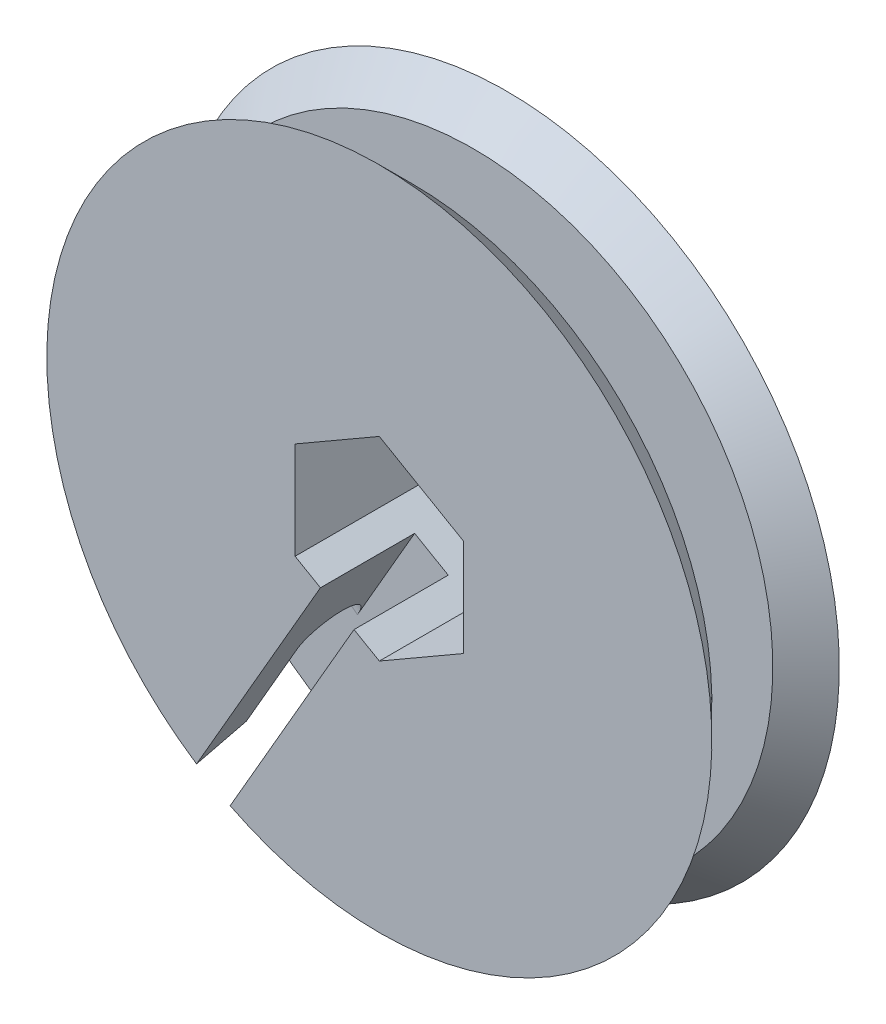
ISO-10303-21;
HEADER;
FILE_DESCRIPTION(('STEP AP214'),'2;1');
FILE_NAME('part.step','',(''),(''),'','','');
FILE_SCHEMA(('AUTOMOTIVE_DESIGN { 1 0 10303 214 1 1 1 1 }'));
ENDSEC;
DATA;
#1=APPLICATION_CONTEXT('core data for automotive mechanical design processes');
#2=APPLICATION_PROTOCOL_DEFINITION('international standard','automotive_design',2000,#1);
#3=PRODUCT_CONTEXT('',#1,'mechanical');
#4=PRODUCT('Part','Part','',(#3));
#5=PRODUCT_RELATED_PRODUCT_CATEGORY('part','',(#4));
#6=PRODUCT_DEFINITION_FORMATION('','',#4);
#7=PRODUCT_DEFINITION_CONTEXT('part definition',#1,'design');
#8=PRODUCT_DEFINITION('design','',#6,#7);
#9=PRODUCT_DEFINITION_SHAPE('','',#8);
#10=(LENGTH_UNIT() NAMED_UNIT(*) SI_UNIT(.MILLI.,.METRE.));
#11=(NAMED_UNIT(*) PLANE_ANGLE_UNIT() SI_UNIT($,.RADIAN.));
#12=(NAMED_UNIT(*) SI_UNIT($,.STERADIAN.) SOLID_ANGLE_UNIT());
#13=UNCERTAINTY_MEASURE_WITH_UNIT(LENGTH_MEASURE(1.E-05),#10,'distance_accuracy_value','');
#14=(GEOMETRIC_REPRESENTATION_CONTEXT(3) GLOBAL_UNCERTAINTY_ASSIGNED_CONTEXT((#13)) GLOBAL_UNIT_ASSIGNED_CONTEXT((#10,
#11,#12)) REPRESENTATION_CONTEXT('',''));
#15=CARTESIAN_POINT('',(0.,0.,0.));
#16=DIRECTION('',(0.,0.,1.));
#17=DIRECTION('',(1.,0.,0.));
#18=AXIS2_PLACEMENT_3D('',#15,#16,#17);
#19=CARTESIAN_POINT('',(0.,0.,5.75));
#20=DIRECTION('',(0.,0.,-1.));
#21=DIRECTION('',(-1.,0.,0.));
#22=AXIS2_PLACEMENT_3D('',#19,#20,#21);
#23=TOROIDAL_SURFACE('',#22,18.,2.75);
#24=CARTESIAN_POINT('',(0.,0.,3.));
#25=DIRECTION('',(0.,0.,-1.));
#26=DIRECTION('',(-1.,0.,0.));
#27=AXIS2_PLACEMENT_3D('',#24,#25,#26);
#28=CIRCLE('',#27,18.);
#29=CARTESIAN_POINT('',(-10.4729087452961,-14.6396100498852,3.));
#30=VERTEX_POINT('',#29);
#31=CARTESIAN_POINT('',(-7.44181983205055,-16.3896100498852,3.));
#32=VERTEX_POINT('',#31);
#33=EDGE_CURVE('E187',#30,#32,#28,.T.);
#34=ORIENTED_EDGE('',*,*,#33,.F.);
#35=CARTESIAN_POINT('',(-11.6302072230688,-16.6441098129096,4.2499890800237));
#36=CARTESIAN_POINT('',(-11.5878732108356,-16.5707851528336,4.12038726326359));
#37=CARTESIAN_POINT('',(-11.5400194636918,-16.4879000314479,3.99785967698924));
#38=CARTESIAN_POINT('',(-11.4346544351728,-16.3054024487122,3.77053264273934));
#39=CARTESIAN_POINT('',(-11.3771312197183,-16.2057693169302,3.66575542714724));
#40=CARTESIAN_POINT('',(-11.2541439715946,-15.9927491544968,3.47704626531254));
#41=CARTESIAN_POINT('',(-11.1886850749709,-15.8793710197372,3.39310094255813));
#42=CARTESIAN_POINT('',(-11.0516846548416,-15.6420793314149,3.24833269201992));
#43=CARTESIAN_POINT('',(-10.9801446350101,-15.5181683822924,3.18750406842389));
#44=CARTESIAN_POINT('',(-10.8327692864991,-15.2629067908881,3.09045597404014));
#45=CARTESIAN_POINT('',(-10.756921756323,-15.1315350149945,3.05431061615199));
#46=CARTESIAN_POINT('',(-10.6032691672833,-14.8654009240632,3.00790259502964));
#47=CARTESIAN_POINT('',(-10.5254639893024,-14.7306384027084,2.99764151064401));
#48=CARTESIAN_POINT('',(-10.3698236442787,-14.4610614174198,3.00327820116145));
#49=CARTESIAN_POINT('',(-10.2919892870546,-14.3262483561332,3.01926568155113));
#50=CARTESIAN_POINT('',(-10.138761481491,-14.0608500117647,3.07711058119008));
#51=CARTESIAN_POINT('',(-10.0633680610195,-13.9302647769516,3.11896829568908));
#52=CARTESIAN_POINT('',(-9.91706211154782,-13.6768554390171,3.227456962004));
#53=CARTESIAN_POINT('',(-9.84615565399839,-13.5540418519568,3.29412067492037));
#54=CARTESIAN_POINT('',(-9.7109597319452,-13.3198756459845,3.45035594958466));
#55=CARTESIAN_POINT('',(-9.64667022188305,-13.2085229481632,3.5399273535959));
#56=CARTESIAN_POINT('',(-9.5266850924901,-13.0007026079019,3.73926775614399));
#57=CARTESIAN_POINT('',(-9.47097223958232,-12.904205116031,3.8489952538858));
#58=CARTESIAN_POINT('',(-9.369605803163,-12.7286332979705,4.08568511296534));
#59=CARTESIAN_POINT('',(-9.32395196119028,-12.649558524113,4.21264703133785));
#60=CARTESIAN_POINT('',(-9.24425758650131,-12.5115238180743,4.47950803741538));
#61=CARTESIAN_POINT('',(-9.2101583382367,-12.4524621875801,4.61933698066279));
#62=CARTESIAN_POINT('',(-9.1542609013387,-12.3556449868599,4.90850620417376));
#63=CARTESIAN_POINT('',(-9.13246226007002,-12.3178886326466,5.05784613422883));
#64=CARTESIAN_POINT('',(-9.10190881403054,-12.2649685117599,5.36085839077977));
#65=CARTESIAN_POINT('',(-9.09307831668697,-12.2496736417047,5.51450019913872));
#66=CARTESIAN_POINT('',(-9.0884830588504,-12.2417144216579,5.8225617680831));
#67=CARTESIAN_POINT('',(-9.09271800466835,-12.2490495629819,5.97698151110398));
#68=CARTESIAN_POINT('',(-9.11409403291119,-12.2860739299625,6.28172881303999));
#69=CARTESIAN_POINT('',(-9.13119631661494,-12.3156959542629,6.43206726905796));
#70=CARTESIAN_POINT('',(-9.17775529923944,-12.3963384777172,6.72488423472456));
#71=CARTESIAN_POINT('',(-9.20721206183191,-12.4473590871539,6.86736270386061));
#72=CARTESIAN_POINT('',(-9.27768328688092,-12.5694188294104,7.14071851310316));
#73=CARTESIAN_POINT('',(-9.31871908453953,-12.6404949158842,7.27157384598979));
#74=CARTESIAN_POINT('',(-9.41113662763013,-12.8005667960278,7.51774629299881));
#75=CARTESIAN_POINT('',(-9.46251865496873,-12.8895630779742,7.63306298359256));
#76=CARTESIAN_POINT('',(-9.57446578789301,-13.0834611999607,7.84555963013542));
#77=CARTESIAN_POINT('',(-9.63507929102786,-13.188446867015,7.94263759464087));
#78=CARTESIAN_POINT('',(-9.76355670512832,-13.410976275862,8.1152004491073));
#79=CARTESIAN_POINT('',(-9.83142084447257,-13.5285204132182,8.19068465863831));
#80=CARTESIAN_POINT('',(-9.97288685280419,-13.7735467271925,8.31834789330166));
#81=CARTESIAN_POINT('',(-10.0465189324637,-13.9010812302298,8.37039303424943));
#82=CARTESIAN_POINT('',(-10.1970999724105,-14.1618952420742,8.44910547318261));
#83=CARTESIAN_POINT('',(-10.2740490002385,-14.2951748678653,8.47577225415122));
#84=CARTESIAN_POINT('',(-10.4293269764353,-14.5641242119346,8.50301786462417));
#85=CARTESIAN_POINT('',(-10.5076593704363,-14.6997998982228,8.50351823566752));
#86=CARTESIAN_POINT('',(-10.6632540383335,-14.9692977684076,8.47819859893682));
#87=CARTESIAN_POINT('',(-10.7405163115465,-15.1031199511209,8.45237857436141));
#88=CARTESIAN_POINT('',(-10.891734265545,-15.3650371304628,8.3751351096366));
#89=CARTESIAN_POINT('',(-10.9656914923691,-15.4931348049092,8.32372378018213));
#90=CARTESIAN_POINT('',(-11.1082211642045,-15.7400034381142,8.19672391504663));
#91=CARTESIAN_POINT('',(-11.1767936716681,-15.8587745050435,8.12113565982292));
#92=CARTESIAN_POINT('',(-11.3063816981475,-16.0832275509584,7.94816196087622));
#93=CARTESIAN_POINT('',(-11.3674194593242,-16.1889480544966,7.85084317571571));
#94=CARTESIAN_POINT('',(-11.4804185505915,-16.3846682217808,7.63701751113077));
#95=CARTESIAN_POINT('',(-11.5323800506601,-16.474668179937,7.52051099112858));
#96=CARTESIAN_POINT('',(-11.6255340389371,-16.6360156205605,7.27211090960717));
#97=CARTESIAN_POINT('',(-11.6667681887244,-16.707435262999,7.14027984191858));
#98=CARTESIAN_POINT('',(-11.737538955159,-16.8300138261543,6.86461190499521));
#99=CARTESIAN_POINT('',(-11.7670762653426,-16.8811739481113,6.72077574818616));
#100=CARTESIAN_POINT('',(-11.8135148192723,-16.9616078829475,6.42572285174617));
#101=CARTESIAN_POINT('',(-11.8304602332982,-16.9909582009957,6.27453391265812));
#102=CARTESIAN_POINT('',(-11.851395923593,-17.0272198802777,5.96856786256901));
#103=CARTESIAN_POINT('',(-11.8553831217245,-17.0341259100214,5.81378990781392));
#104=CARTESIAN_POINT('',(-11.8502860409475,-17.0252975071453,5.50533036907906));
#105=CARTESIAN_POINT('',(-11.8412200445128,-17.0095947406991,5.3516475540415));
#106=CARTESIAN_POINT('',(-11.8103136442289,-16.9560632851284,5.04964310594008));
#107=CARTESIAN_POINT('',(-11.7884887742966,-16.918261501537,4.90131518605536));
#108=CARTESIAN_POINT('',(-11.7433769108242,-16.8401254619788,4.66890948976915));
#109=CARTESIAN_POINT('',(-11.7238093301179,-16.8062334180142,4.58186827503471));
#110=CARTESIAN_POINT('',(-11.6802615416742,-16.7308064358725,4.41231986651793));
#111=CARTESIAN_POINT('',(-11.6562813386246,-16.6892715058149,4.32981266791909));
#112=CARTESIAN_POINT('',(-11.6302072230688,-16.6441098129096,4.2499890800237));
#113=B_SPLINE_CURVE_WITH_KNOTS('',3,(#35,#36,#37,#38,#39,#40,#41,#42,#43,#44,#45,#46,#47,#48,
#49,#50,#51,#52,#53,#54,#55,#56,#57,#58,#59,#60,#61,#62,#63,#64,#65,#66,#67,#68,#69,#70,#71,#72,
#73,#74,#75,#76,#77,#78,#79,#80,#81,#82,#83,#84,#85,#86,#87,#88,#89,#90,#91,#92,#93,#94,#95,#96,
#97,#98,#99,#100,#101,#102,#103,#104,#105,#106,#107,#108,#109,#110,#111,#112),.UNSPECIFIED.,.T.,
.F.,(4,2,2,2,2,2,2,2,2,2,2,2,2,2,2,2,2,2,2,2,2,2,2,2,2,2,2,2,2,2,2,2,2,2,2,2,2,2,4),(0.,
0.464072250797451,0.928721523454805,1.39307166040032,1.85730731003851,2.32293079596454,
2.78858268257939,3.2558292675635,3.72308118520024,4.19095240198698,4.65882039721521,
5.12573564954755,5.59263890332939,6.05713266672856,6.52160933666363,6.98336401904191,
7.44510832203196,7.90546588540078,8.36582582136016,8.82703960558291,9.28826595832662,
9.75199935995543,10.2157473724454,10.6821117266015,11.1484855814915,11.6162577513761,
12.0840302198584,12.5515815323029,13.0191274212529,13.4852583454795,13.9513805391933,
14.4156644880718,14.8799209042123,15.3425409970934,15.8052709742448,16.267353475904,
16.728874560743,17.014703512683,17.3005321609797),.UNSPECIFIED.);
#114=CARTESIAN_POINT('',(-10.4729087452961,-14.6396100498852,8.5));
#115=VERTEX_POINT('',#114);
#116=EDGE_CURVE('E169',#30,#115,#113,.T.);
#117=ORIENTED_EDGE('',*,*,#116,.T.);
#118=CARTESIAN_POINT('',(0.,0.,8.5));
#119=DIRECTION('',(0.,0.,-1.));
#120=DIRECTION('',(-1.,0.,0.));
#121=AXIS2_PLACEMENT_3D('',#118,#119,#120);
#122=CIRCLE('',#121,18.);
#123=CARTESIAN_POINT('',(-7.44181983205055,-16.3896100498852,8.5));
#124=VERTEX_POINT('',#123);
#125=EDGE_CURVE('E11',#115,#124,#122,.T.);
#126=ORIENTED_EDGE('',*,*,#125,.T.);
#127=CARTESIAN_POINT('',(-8.37169437330341,-18.0002,7.78309526483977));
#128=CARTESIAN_POINT('',(-8.34290417700881,-17.9503339172579,7.83534598348775));
#129=CARTESIAN_POINT('',(-8.31300493667212,-17.898546913887,7.88514571672198));
#130=CARTESIAN_POINT('',(-8.25121458982801,-17.7915228937357,7.97952028212905));
#131=CARTESIAN_POINT('',(-8.21932361925915,-17.7362861124078,8.02409547028883));
#132=CARTESIAN_POINT('',(-8.15379967419848,-17.6227953104503,8.10766998921819));
#133=CARTESIAN_POINT('',(-8.1201681907222,-17.5645438723355,8.1466739882771));
#134=CARTESIAN_POINT('',(-8.05139346199464,-17.4454225479026,8.21887560465343));
#135=CARTESIAN_POINT('',(-8.01625022690089,-17.3845526791779,8.25207326097632));
#136=CARTESIAN_POINT('',(-7.90889078128192,-17.1986006646934,8.34261166395664));
#137=CARTESIAN_POINT('',(-7.83471043544557,-17.0701165367818,8.39094161222455));
#138=CARTESIAN_POINT('',(-7.68340314178073,-16.8080446165986,8.46204593247323));
#139=CARTESIAN_POINT('',(-7.6062766129129,-16.6744575499881,8.48482392417254));
#140=CARTESIAN_POINT('',(-7.45098531383821,-16.4054851300173,8.50430626389989));
#141=CARTESIAN_POINT('',(-7.37281830670653,-16.2700959021897,8.50094021856554));
#142=CARTESIAN_POINT('',(-7.2178620980298,-16.0017038758133,8.46806315037303));
#143=CARTESIAN_POINT('',(-7.14107311214338,-15.8687014507963,8.43854807100676));
#144=CARTESIAN_POINT('',(-6.99090664980816,-15.6086055084389,8.35411831371802));
#145=CARTESIAN_POINT('',(-6.9175360732961,-15.4815239421394,8.29915452206395));
#146=CARTESIAN_POINT('',(-6.77646128691792,-15.2371752444654,8.16534749049601));
#147=CARTESIAN_POINT('',(-6.70875674031571,-15.119907529847,8.08650567095801));
#148=CARTESIAN_POINT('',(-6.58102602779159,-14.8986714460682,7.90724659132727));
#149=CARTESIAN_POINT('',(-6.52099107139563,-14.7946878513602,7.80685439151984));
#150=CARTESIAN_POINT('',(-6.41024650035678,-14.6028726276585,7.58725161760995));
#151=CARTESIAN_POINT('',(-6.35953686892767,-14.5150409695902,7.46804107738252));
#152=CARTESIAN_POINT('',(-6.26913990319727,-14.3584688320951,7.21475574364981));
#153=CARTESIAN_POINT('',(-6.2294034004132,-14.289643190358,7.08075115141389));
#154=CARTESIAN_POINT('',(-6.16182231311254,-14.1725893135225,6.80124130200334));
#155=CARTESIAN_POINT('',(-6.13397722812228,-14.1243602115783,6.65573652914191));
#156=CARTESIAN_POINT('',(-6.09114032511835,-14.0501645191366,6.35829473792065));
#157=CARTESIAN_POINT('',(-6.07607225874013,-14.0240658625977,6.20640163692264));
#158=CARTESIAN_POINT('',(-6.05895719690165,-13.9944217059188,5.89970988207622));
#159=CARTESIAN_POINT('',(-6.05690986374064,-13.9908756208639,5.74491130368761));
#160=CARTESIAN_POINT('',(-6.06587886773261,-14.0064103914713,5.43745675481903));
#161=CARTESIAN_POINT('',(-6.07684327429412,-14.0254013007106,5.28479471095207));
#162=CARTESIAN_POINT('',(-6.1114236215487,-14.0852962190989,4.98531661395201));
#163=CARTESIAN_POINT('',(-6.13503951810695,-14.1262001518041,4.83850054042711));
#164=CARTESIAN_POINT('',(-6.19424735114996,-14.2287511268407,4.55475521815561));
#165=CARTESIAN_POINT('',(-6.22984739048379,-14.2904122037183,4.41783273505633));
#166=CARTESIAN_POINT('',(-6.31198288269177,-14.4326750493272,4.15780592702638));
#167=CARTESIAN_POINT('',(-6.35851864088952,-14.5132773468945,4.03470198804919));
#168=CARTESIAN_POINT('',(-6.46143937791122,-14.6915412925685,3.80515811157304));
#169=CARTESIAN_POINT('',(-6.51787104047976,-14.7892837992928,3.69880190855386));
#170=CARTESIAN_POINT('',(-6.63881491753643,-14.9987647392193,3.5064124916221));
#171=CARTESIAN_POINT('',(-6.70332729936625,-15.1105034622658,3.42037969868869));
#172=CARTESIAN_POINT('',(-6.83901321120814,-15.3455183554473,3.27055223248416));
#173=CARTESIAN_POINT('',(-6.91022384515789,-15.4688587914874,3.20689195143484));
#174=CARTESIAN_POINT('',(-7.05696654870152,-15.723024609665,3.10428039759601));
#175=CARTESIAN_POINT('',(-7.13249879956462,-15.85385030577,3.06533016209321));
#176=CARTESIAN_POINT('',(-7.28604516451325,-16.1198004111785,3.01312589761576));
#177=CARTESIAN_POINT('',(-7.36406755187968,-16.254939150225,2.99996916362505));
#178=CARTESIAN_POINT('',(-7.52011463286922,-16.5252206228717,3.00003094241118));
#179=CARTESIAN_POINT('',(-7.5981393264603,-16.6603633564164,3.01325050653574));
#180=CARTESIAN_POINT('',(-7.75200767116121,-16.9268711471149,3.06572514457234));
#181=CARTESIAN_POINT('',(-7.82785008425842,-17.0582340599679,3.1049947042857));
#182=CARTESIAN_POINT('',(-7.97513167120267,-17.3133332515747,3.20851804393509));
#183=CARTESIAN_POINT('',(-8.04657304279469,-17.4370733369345,3.27275923470217));
#184=CARTESIAN_POINT('',(-8.16095837520867,-17.6351945443162,3.3998723655637));
#185=CARTESIAN_POINT('',(-8.20566460294572,-17.7126280021715,3.45650942103528));
#186=CARTESIAN_POINT('',(-8.29148601802384,-17.8612750534642,3.57955761733142));
#187=CARTESIAN_POINT('',(-8.33260593598289,-17.9324968405724,3.64595556233421));
#188=CARTESIAN_POINT('',(-8.37169437330341,-18.0002,3.71690473516024));
#189=B_SPLINE_CURVE_WITH_KNOTS('',3,(#127,#128,#129,#130,#131,#132,#133,#134,#135,#136,#137,
#138,#139,#140,#141,#142,#143,#144,#145,#146,#147,#148,#149,#150,#151,#152,#153,#154,#155,#156,
#157,#158,#159,#160,#161,#162,#163,#164,#165,#166,#167,#168,#169,#170,#171,#172,#173,#174,#175,
#176,#177,#178,#179,#180,#181,#182,#183,#184,#185,#186,#187,#188),.UNSPECIFIED.,.F.,.F.,(4,2,2,
2,2,2,2,2,2,2,2,2,2,2,2,2,2,2,2,2,2,2,2,2,2,2,2,2,2,2,4),(0.,0.233183931268337,
0.466351964740276,0.699323457954253,0.932293386067148,1.39799172016466,1.86362407458475,
2.33051058753583,2.79746954142753,3.26533346479391,3.73316956290787,4.20046454755202,
4.66775869102445,5.13292368822005,5.59806910610274,6.06041877718607,6.52275645689654,
6.98325510937192,7.44375215540506,7.90456118517497,8.3653830821921,8.82844043918471,
9.29150738710739,9.75731026363949,10.2231326925098,10.690708882566,11.1583037103773,
11.6261587750904,12.0937782811581,12.4106490668425,12.7270953462373),.UNSPECIFIED.);
#190=EDGE_CURVE('E222',#124,#32,#189,.T.);
#191=ORIENTED_EDGE('',*,*,#190,.T.);
#192=EDGE_LOOP('',(#34,#117,#126,#191));
#193=FACE_BOUND('',#192,.T.);
#194=ADVANCED_FACE('F41',(#193),#23,.F.);
#195=CARTESIAN_POINT('',(0.,0.,8.5));
#196=DIRECTION('',(0.,0.,-1.));
#197=DIRECTION('',(-1.,0.,0.));
#198=AXIS2_PLACEMENT_3D('',#195,#196,#197);
#199=PLANE('',#198);
#200=DIRECTION('',(0.5,0.866025403784439,0.));
#201=VECTOR('',#200,1.);
#202=CARTESIAN_POINT('',(-1.51554445662277,0.874999999999998,8.5));
#203=LINE('',#202,#201);
#204=CARTESIAN_POINT('',(-14.9871581313093,-22.4585193444967,8.5));
#205=VERTEX_POINT('',#204);
#206=EDGE_CURVE('E215',#205,#115,#203,.T.);
#207=ORIENTED_EDGE('',*,*,#206,.F.);
#208=CARTESIAN_POINT('',(0.,0.,8.5));
#209=DIRECTION('',(0.,0.,-1.));
#210=DIRECTION('',(-1.,0.,0.));
#211=AXIS2_PLACEMENT_3D('',#208,#209,#210);
#212=CIRCLE('',#211,27.);
#213=CARTESIAN_POINT('',(-11.9560692180637,-24.2085193444967,8.5));
#214=VERTEX_POINT('',#213);
#215=EDGE_CURVE('E49',#205,#214,#212,.T.);
#216=ORIENTED_EDGE('',*,*,#215,.T.);
#217=DIRECTION('',(-0.5,-0.866025403784439,0.));
#218=VECTOR('',#217,1.);
#219=CARTESIAN_POINT('',(1.51554445662277,-0.875,8.5));
#220=LINE('',#219,#218);
#221=EDGE_CURVE('E214',#124,#214,#220,.T.);
#222=ORIENTED_EDGE('',*,*,#221,.F.);
#223=ORIENTED_EDGE('',*,*,#125,.F.);
#224=EDGE_LOOP('',(#207,#216,#222,#223));
#225=FACE_BOUND('',#224,.T.);
#226=ADVANCED_FACE('F212',(#225),#199,.T.);
#227=CARTESIAN_POINT('',(0.,0.,8.5));
#228=DIRECTION('',(0.,0.,1.));
#229=DIRECTION('',(1.,0.,0.));
#230=AXIS2_PLACEMENT_3D('',#227,#228,#229);
#231=CONICAL_SURFACE('',#230,27.,0.785398163397447);
#232=CARTESIAN_POINT('',(-16.4901020464149,-25.0616945663861,11.5002));
#233=CARTESIAN_POINT('',(-16.2396196675506,-24.6278463597925,11.0000832878885));
#234=CARTESIAN_POINT('',(-15.9891248009833,-24.1939765238628,10.4999915985323));
#235=CARTESIAN_POINT('',(-15.4881100923769,-23.3261935932171,9.49985826519894));
#236=CARTESIAN_POINT('',(-15.2375902503377,-22.8922804985012,8.99981662122185));
#237=CARTESIAN_POINT('',(-14.9870579205956,-22.4583457744491,8.4998));
#238=B_SPLINE_CURVE_WITH_KNOTS('',3,(#232,#233,#234,#235,#236,#237),.UNSPECIFIED.,.F.,.F.,(4,2,
4),(0.,2.12361524156916,4.24723048369599),.UNSPECIFIED.);
#239=CARTESIAN_POINT('',(-16.4900018758417,-25.0615210658639,11.5));
#240=VERTEX_POINT('',#239);
#241=EDGE_CURVE('E219',#240,#205,#238,.T.);
#242=ORIENTED_EDGE('',*,*,#241,.F.);
#243=CARTESIAN_POINT('',(0.,0.,11.5));
#244=DIRECTION('',(0.,0.,-1.));
#245=DIRECTION('',(-1.,0.,0.));
#246=AXIS2_PLACEMENT_3D('',#243,#244,#245);
#247=CIRCLE('',#246,30.);
#248=CARTESIAN_POINT('',(-13.4589129625961,-26.8115210658639,11.5));
#249=VERTEX_POINT('',#248);
#250=EDGE_CURVE('E206',#240,#249,#247,.T.);
#251=ORIENTED_EDGE('',*,*,#250,.T.);
#252=CARTESIAN_POINT('',(-11.95596900735,-24.2083457744491,8.4998));
#253=CARTESIAN_POINT('',(-12.2065013370922,-24.6422804985012,8.99981662122185));
#254=CARTESIAN_POINT('',(-12.4570211791314,-25.0761935932171,9.49985826519894));
#255=CARTESIAN_POINT('',(-12.9580358877378,-25.9439765238628,10.4999915985323));
#256=CARTESIAN_POINT('',(-13.2085307543051,-26.3778463597925,11.0000832878885));
#257=CARTESIAN_POINT('',(-13.4590131331693,-26.8116945663861,11.5002));
#258=B_SPLINE_CURVE_WITH_KNOTS('',3,(#252,#253,#254,#255,#256,#257),.UNSPECIFIED.,.F.,.F.,(4,2,
4),(0.,2.12361524212683,4.24723048369599),.UNSPECIFIED.);
#259=EDGE_CURVE('E131',#214,#249,#258,.T.);
#260=ORIENTED_EDGE('',*,*,#259,.F.);
#261=ORIENTED_EDGE('',*,*,#215,.F.);
#262=EDGE_LOOP('',(#242,#251,#260,#261));
#263=FACE_BOUND('',#262,.T.);
#264=ADVANCED_FACE('F218',(#263),#231,.T.);
#265=CARTESIAN_POINT('',(0.,0.,11.5));
#266=DIRECTION('',(0.,0.,1.));
#267=DIRECTION('',(1.,0.,0.));
#268=AXIS2_PLACEMENT_3D('',#265,#266,#267);
#269=PLANE('',#268);
#270=DIRECTION('',(-0.5,-0.866025403784439,0.));
#271=VECTOR('',#270,1.);
#272=CARTESIAN_POINT('',(-17.8155444566228,-27.3574281633727,11.5));
#273=LINE('',#272,#271);
#274=CARTESIAN_POINT('',(-5.31554445662277,-5.70679306876173,11.5));
#275=VERTEX_POINT('',#274);
#276=EDGE_CURVE('E135',#275,#240,#273,.T.);
#277=ORIENTED_EDGE('',*,*,#276,.F.);
#278=DIRECTION('',(-0.866025403784439,0.5,0.));
#279=VECTOR('',#278,1.);
#280=CARTESIAN_POINT('',(0.,-8.77572409168231,11.5));
#281=LINE('',#280,#279);
#282=CARTESIAN_POINT('',(-7.6,-4.38786204584116,11.5));
#283=VERTEX_POINT('',#282);
#284=EDGE_CURVE('E152',#275,#283,#281,.T.);
#285=ORIENTED_EDGE('',*,*,#284,.T.);
#286=DIRECTION('',(0.,1.,0.));
#287=VECTOR('',#286,1.);
#288=CARTESIAN_POINT('',(-7.6,-4.38786204584116,11.5));
#289=LINE('',#288,#287);
#290=CARTESIAN_POINT('',(-7.6,4.38786204584116,11.5));
#291=VERTEX_POINT('',#290);
#292=EDGE_CURVE('E151',#283,#291,#289,.T.);
#293=ORIENTED_EDGE('',*,*,#292,.T.);
#294=DIRECTION('',(0.866025403784439,0.5,0.));
#295=VECTOR('',#294,1.);
#296=CARTESIAN_POINT('',(-7.6,4.38786204584116,11.5));
#297=LINE('',#296,#295);
#298=CARTESIAN_POINT('',(0.,8.77572409168231,11.5));
#299=VERTEX_POINT('',#298);
#300=EDGE_CURVE('E155',#291,#299,#297,.T.);
#301=ORIENTED_EDGE('',*,*,#300,.T.);
#302=DIRECTION('',(0.866025403784439,-0.5,0.));
#303=VECTOR('',#302,1.);
#304=CARTESIAN_POINT('',(0.,8.77572409168231,11.5));
#305=LINE('',#304,#303);
#306=CARTESIAN_POINT('',(7.6,4.38786204584116,11.5));
#307=VERTEX_POINT('',#306);
#308=EDGE_CURVE('E162',#299,#307,#305,.T.);
#309=ORIENTED_EDGE('',*,*,#308,.T.);
#310=DIRECTION('',(0.,-1.,0.));
#311=VECTOR('',#310,1.);
#312=CARTESIAN_POINT('',(7.6,4.38786204584116,11.5));
#313=LINE('',#312,#311);
#314=CARTESIAN_POINT('',(7.6,-4.38786204584116,11.5));
#315=VERTEX_POINT('',#314);
#316=EDGE_CURVE('E184',#307,#315,#313,.T.);
#317=ORIENTED_EDGE('',*,*,#316,.T.);
#318=DIRECTION('',(-0.866025403784439,-0.5,0.));
#319=VECTOR('',#318,1.);
#320=CARTESIAN_POINT('',(7.6,-4.38786204584116,11.5));
#321=LINE('',#320,#319);
#322=CARTESIAN_POINT('',(0.,-8.77572409168231,11.5));
#323=VERTEX_POINT('',#322);
#324=EDGE_CURVE('E150',#315,#323,#321,.T.);
#325=ORIENTED_EDGE('',*,*,#324,.T.);
#326=CARTESIAN_POINT('',(-2.28445554337723,-7.45679306876173,11.5));
#327=VERTEX_POINT('',#326);
#328=EDGE_CURVE('E63',#323,#327,#281,.T.);
#329=ORIENTED_EDGE('',*,*,#328,.T.);
#330=DIRECTION('',(0.5,0.866025403784439,0.));
#331=VECTOR('',#330,1.);
#332=CARTESIAN_POINT('',(-14.7844555433772,-29.1074281633727,11.5));
#333=LINE('',#332,#331);
#334=EDGE_CURVE('E128',#249,#327,#333,.T.);
#335=ORIENTED_EDGE('',*,*,#334,.F.);
#336=ORIENTED_EDGE('',*,*,#250,.F.);
#337=EDGE_LOOP('',(#277,#285,#293,#301,#309,#317,#325,#329,#335,#336));
#338=FACE_BOUND('',#337,.T.);
#339=ADVANCED_FACE('F147',(#338),#269,.T.);
#340=CARTESIAN_POINT('',(0.,0.,0.));
#341=DIRECTION('',(0.,0.,-1.));
#342=DIRECTION('',(-1.,0.,0.));
#343=AXIS2_PLACEMENT_3D('',#340,#341,#342);
#344=PLANE('',#343);
#345=DIRECTION('',(0.,-1.,0.));
#346=VECTOR('',#345,1.);
#347=CARTESIAN_POINT('',(7.6,4.38786204584116,0.));
#348=LINE('',#347,#346);
#349=CARTESIAN_POINT('',(7.6,4.38786204584116,0.));
#350=VERTEX_POINT('',#349);
#351=CARTESIAN_POINT('',(7.6,-4.38786204584116,0.));
#352=VERTEX_POINT('',#351);
#353=EDGE_CURVE('E166',#350,#352,#348,.T.);
#354=ORIENTED_EDGE('',*,*,#353,.F.);
#355=DIRECTION('',(0.866025403784439,-0.5,0.));
#356=VECTOR('',#355,1.);
#357=CARTESIAN_POINT('',(0.,8.77572409168231,0.));
#358=LINE('',#357,#356);
#359=CARTESIAN_POINT('',(0.,8.77572409168231,0.));
#360=VERTEX_POINT('',#359);
#361=EDGE_CURVE('E181',#360,#350,#358,.T.);
#362=ORIENTED_EDGE('',*,*,#361,.F.);
#363=DIRECTION('',(0.866025403784439,0.5,0.));
#364=VECTOR('',#363,1.);
#365=CARTESIAN_POINT('',(-7.6,4.38786204584116,0.));
#366=LINE('',#365,#364);
#367=CARTESIAN_POINT('',(-7.6,4.38786204584116,0.));
#368=VERTEX_POINT('',#367);
#369=EDGE_CURVE('E178',#368,#360,#366,.T.);
#370=ORIENTED_EDGE('',*,*,#369,.F.);
#371=DIRECTION('',(0.,1.,0.));
#372=VECTOR('',#371,1.);
#373=CARTESIAN_POINT('',(-7.6,-4.38786204584116,0.));
#374=LINE('',#373,#372);
#375=CARTESIAN_POINT('',(-7.6,-4.38786204584116,0.));
#376=VERTEX_POINT('',#375);
#377=EDGE_CURVE('E175',#376,#368,#374,.T.);
#378=ORIENTED_EDGE('',*,*,#377,.F.);
#379=DIRECTION('',(-0.866025403784439,0.5,0.));
#380=VECTOR('',#379,1.);
#381=CARTESIAN_POINT('',(0.,-8.77572409168231,0.));
#382=LINE('',#381,#380);
#383=CARTESIAN_POINT('',(0.,-8.77572409168231,0.));
#384=VERTEX_POINT('',#383);
#385=EDGE_CURVE('E172',#384,#376,#382,.T.);
#386=ORIENTED_EDGE('',*,*,#385,.F.);
#387=DIRECTION('',(-0.866025403784439,-0.5,0.));
#388=VECTOR('',#387,1.);
#389=CARTESIAN_POINT('',(7.6,-4.38786204584116,0.));
#390=LINE('',#389,#388);
#391=EDGE_CURVE('E168',#352,#384,#390,.T.);
#392=ORIENTED_EDGE('',*,*,#391,.F.);
#393=EDGE_LOOP('',(#354,#362,#370,#378,#386,#392));
#394=FACE_BOUND('',#393,.T.);
#395=CARTESIAN_POINT('',(0.,0.,0.));
#396=DIRECTION('',(0.,0.,-1.));
#397=DIRECTION('',(-1.,0.,0.));
#398=AXIS2_PLACEMENT_3D('',#395,#396,#397);
#399=CIRCLE('',#398,30.);
#400=CARTESIAN_POINT('',(-30.,0.,0.));
#401=VERTEX_POINT('',#400);
#402=EDGE_CURVE('E203',#401,#401,#399,.T.);
#403=ORIENTED_EDGE('',*,*,#402,.T.);
#404=EDGE_LOOP('',(#403));
#405=FACE_BOUND('',#404,.T.);
#406=ADVANCED_FACE('F272',(#394,#405),#344,.T.);
#407=CARTESIAN_POINT('',(0.,0.,0.));
#408=DIRECTION('',(0.,0.,-1.));
#409=DIRECTION('',(-1.,0.,0.));
#410=AXIS2_PLACEMENT_3D('',#407,#408,#409);
#411=CONICAL_SURFACE('',#410,30.,0.785398163397448);
#412=CARTESIAN_POINT('',(0.,0.,3.));
#413=DIRECTION('',(0.,0.,-1.));
#414=DIRECTION('',(-1.,0.,0.));
#415=AXIS2_PLACEMENT_3D('',#412,#413,#414);
#416=CIRCLE('',#415,27.);
#417=CARTESIAN_POINT('',(-27.,0.,3.));
#418=VERTEX_POINT('',#417);
#419=EDGE_CURVE('E200',#418,#418,#416,.T.);
#420=ORIENTED_EDGE('',*,*,#419,.T.);
#421=EDGE_LOOP('',(#420));
#422=FACE_BOUND('',#421,.T.);
#423=ORIENTED_EDGE('',*,*,#402,.F.);
#424=EDGE_LOOP('',(#423));
#425=FACE_BOUND('',#424,.T.);
#426=ADVANCED_FACE('F289',(#422,#425),#411,.T.);
#427=CARTESIAN_POINT('',(0.,0.,3.));
#428=DIRECTION('',(0.,0.,1.));
#429=DIRECTION('',(1.,0.,0.));
#430=AXIS2_PLACEMENT_3D('',#427,#428,#429);
#431=PLANE('',#430);
#432=ORIENTED_EDGE('',*,*,#419,.F.);
#433=EDGE_LOOP('',(#432));
#434=FACE_BOUND('',#433,.T.);
#435=ORIENTED_EDGE('',*,*,#33,.T.);
#436=DIRECTION('',(-0.5,-0.866025403784439,0.));
#437=VECTOR('',#436,1.);
#438=CARTESIAN_POINT('',(-14.7844555433772,-29.1074281633727,3.));
#439=LINE('',#438,#437);
#440=CARTESIAN_POINT('',(-2.28445554337723,-7.45679306876173,3.));
#441=VERTEX_POINT('',#440);
#442=EDGE_CURVE('E279',#441,#32,#439,.T.);
#443=ORIENTED_EDGE('',*,*,#442,.F.);
#444=DIRECTION('',(0.866025403784439,-0.5,0.));
#445=VECTOR('',#444,1.);
#446=CARTESIAN_POINT('',(-2.28445554337723,-7.45679306876173,3.));
#447=LINE('',#446,#445);
#448=CARTESIAN_POINT('',(-5.31554445662277,-5.70679306876173,3.));
#449=VERTEX_POINT('',#448);
#450=EDGE_CURVE('E142',#449,#441,#447,.T.);
#451=ORIENTED_EDGE('',*,*,#450,.F.);
#452=DIRECTION('',(0.5,0.866025403784439,0.));
#453=VECTOR('',#452,1.);
#454=CARTESIAN_POINT('',(-17.8155444566228,-27.3574281633727,3.));
#455=LINE('',#454,#453);
#456=EDGE_CURVE('E220',#30,#449,#455,.T.);
#457=ORIENTED_EDGE('',*,*,#456,.F.);
#458=EDGE_LOOP('',(#435,#443,#451,#457));
#459=FACE_BOUND('',#458,.T.);
#460=ADVANCED_FACE('F287',(#434,#459),#431,.T.);
#461=CARTESIAN_POINT('',(7.6,4.38786204584116,11.5));
#462=DIRECTION('',(1.,0.,0.));
#463=DIRECTION('',(0.,0.,-1.));
#464=AXIS2_PLACEMENT_3D('',#461,#462,#463);
#465=PLANE('',#464);
#466=ORIENTED_EDGE('',*,*,#353,.T.);
#467=DIRECTION('',(0.,0.,-1.));
#468=VECTOR('',#467,1.);
#469=CARTESIAN_POINT('',(7.6,-4.38786204584116,11.5));
#470=LINE('',#469,#468);
#471=EDGE_CURVE('E165',#315,#352,#470,.T.);
#472=ORIENTED_EDGE('',*,*,#471,.F.);
#473=ORIENTED_EDGE('',*,*,#316,.F.);
#474=DIRECTION('',(0.,0.,-1.));
#475=VECTOR('',#474,1.);
#476=CARTESIAN_POINT('',(7.6,4.38786204584116,11.5));
#477=LINE('',#476,#475);
#478=EDGE_CURVE('E185',#307,#350,#477,.T.);
#479=ORIENTED_EDGE('',*,*,#478,.T.);
#480=EDGE_LOOP('',(#466,#472,#473,#479));
#481=FACE_BOUND('',#480,.T.);
#482=ADVANCED_FACE('F261',(#481),#465,.F.);
#483=CARTESIAN_POINT('',(0.,8.77572409168231,11.5));
#484=DIRECTION('',(0.5,0.866025403784439,0.));
#485=DIRECTION('',(-0.866025403784439,0.5,0.));
#486=AXIS2_PLACEMENT_3D('',#483,#484,#485);
#487=PLANE('',#486);
#488=ORIENTED_EDGE('',*,*,#361,.T.);
#489=ORIENTED_EDGE('',*,*,#478,.F.);
#490=ORIENTED_EDGE('',*,*,#308,.F.);
#491=DIRECTION('',(0.,0.,-1.));
#492=VECTOR('',#491,1.);
#493=CARTESIAN_POINT('',(0.,8.77572409168231,11.5));
#494=LINE('',#493,#492);
#495=EDGE_CURVE('E188',#299,#360,#494,.T.);
#496=ORIENTED_EDGE('',*,*,#495,.T.);
#497=EDGE_LOOP('',(#488,#489,#490,#496));
#498=FACE_BOUND('',#497,.T.);
#499=ADVANCED_FACE('F297',(#498),#487,.F.);
#500=CARTESIAN_POINT('',(-7.6,4.38786204584116,11.5));
#501=DIRECTION('',(-0.5,0.866025403784439,0.));
#502=DIRECTION('',(-0.866025403784439,-0.5,0.));
#503=AXIS2_PLACEMENT_3D('',#500,#501,#502);
#504=PLANE('',#503);
#505=ORIENTED_EDGE('',*,*,#369,.T.);
#506=ORIENTED_EDGE('',*,*,#495,.F.);
#507=ORIENTED_EDGE('',*,*,#300,.F.);
#508=DIRECTION('',(0.,0.,-1.));
#509=VECTOR('',#508,1.);
#510=CARTESIAN_POINT('',(-7.6,4.38786204584116,11.5));
#511=LINE('',#510,#509);
#512=EDGE_CURVE('E190',#291,#368,#511,.T.);
#513=ORIENTED_EDGE('',*,*,#512,.T.);
#514=EDGE_LOOP('',(#505,#506,#507,#513));
#515=FACE_BOUND('',#514,.T.);
#516=ADVANCED_FACE('F333',(#515),#504,.F.);
#517=CARTESIAN_POINT('',(-7.6,-4.38786204584116,11.5));
#518=DIRECTION('',(-1.,0.,0.));
#519=DIRECTION('',(0.,0.,1.));
#520=AXIS2_PLACEMENT_3D('',#517,#518,#519);
#521=PLANE('',#520);
#522=ORIENTED_EDGE('',*,*,#377,.T.);
#523=ORIENTED_EDGE('',*,*,#512,.F.);
#524=ORIENTED_EDGE('',*,*,#292,.F.);
#525=DIRECTION('',(0.,0.,-1.));
#526=VECTOR('',#525,1.);
#527=CARTESIAN_POINT('',(-7.6,-4.38786204584116,11.5));
#528=LINE('',#527,#526);
#529=EDGE_CURVE('E192',#283,#376,#528,.T.);
#530=ORIENTED_EDGE('',*,*,#529,.T.);
#531=EDGE_LOOP('',(#522,#523,#524,#530));
#532=FACE_BOUND('',#531,.T.);
#533=ADVANCED_FACE('F276',(#532),#521,.F.);
#534=CARTESIAN_POINT('',(0.,-8.77572409168231,11.5));
#535=DIRECTION('',(-0.5,-0.866025403784439,0.));
#536=DIRECTION('',(0.866025403784439,-0.5,0.));
#537=AXIS2_PLACEMENT_3D('',#534,#535,#536);
#538=PLANE('',#537);
#539=ORIENTED_EDGE('',*,*,#284,.F.);
#540=DIRECTION('',(0.,0.,1.));
#541=VECTOR('',#540,1.);
#542=CARTESIAN_POINT('',(-5.31554445662277,-5.70679306876173,-25.0856626352713));
#543=LINE('',#542,#541);
#544=EDGE_CURVE('E143',#449,#275,#543,.T.);
#545=ORIENTED_EDGE('',*,*,#544,.F.);
#546=ORIENTED_EDGE('',*,*,#450,.T.);
#547=DIRECTION('',(0.,0.,1.));
#548=VECTOR('',#547,1.);
#549=CARTESIAN_POINT('',(-2.28445554337723,-7.45679306876173,-25.0856626352713));
#550=LINE('',#549,#548);
#551=EDGE_CURVE('E56',#441,#327,#550,.T.);
#552=ORIENTED_EDGE('',*,*,#551,.T.);
#553=ORIENTED_EDGE('',*,*,#328,.F.);
#554=DIRECTION('',(0.,0.,-1.));
#555=VECTOR('',#554,1.);
#556=CARTESIAN_POINT('',(0.,-8.77572409168231,11.5));
#557=LINE('',#556,#555);
#558=EDGE_CURVE('E194',#323,#384,#557,.T.);
#559=ORIENTED_EDGE('',*,*,#558,.T.);
#560=ORIENTED_EDGE('',*,*,#385,.T.);
#561=ORIENTED_EDGE('',*,*,#529,.F.);
#562=EDGE_LOOP('',(#539,#545,#546,#552,#553,#559,#560,#561));
#563=FACE_BOUND('',#562,.T.);
#564=ADVANCED_FACE('F139',(#563),#538,.F.);
#565=CARTESIAN_POINT('',(7.6,-4.38786204584116,11.5));
#566=DIRECTION('',(0.5,-0.866025403784439,0.));
#567=DIRECTION('',(0.866025403784439,0.5,0.));
#568=AXIS2_PLACEMENT_3D('',#565,#566,#567);
#569=PLANE('',#568);
#570=ORIENTED_EDGE('',*,*,#391,.T.);
#571=ORIENTED_EDGE('',*,*,#558,.F.);
#572=ORIENTED_EDGE('',*,*,#324,.F.);
#573=ORIENTED_EDGE('',*,*,#471,.T.);
#574=EDGE_LOOP('',(#570,#571,#572,#573));
#575=FACE_BOUND('',#574,.T.);
#576=ADVANCED_FACE('F265',(#575),#569,.F.);
#577=CARTESIAN_POINT('',(-17.8155444566228,-27.3574281633727,-25.0856626352713));
#578=DIRECTION('',(-0.866025403784439,0.5,0.));
#579=DIRECTION('',(-0.5,-0.866025403784439,0.));
#580=AXIS2_PLACEMENT_3D('',#577,#578,#579);
#581=PLANE('',#580);
#582=ORIENTED_EDGE('',*,*,#456,.T.);
#583=ORIENTED_EDGE('',*,*,#544,.T.);
#584=ORIENTED_EDGE('',*,*,#276,.T.);
#585=ORIENTED_EDGE('',*,*,#241,.T.);
#586=ORIENTED_EDGE('',*,*,#206,.T.);
#587=ORIENTED_EDGE('',*,*,#116,.F.);
#588=EDGE_LOOP('',(#582,#583,#584,#585,#586,#587));
#589=FACE_BOUND('',#588,.T.);
#590=ADVANCED_FACE('F238',(#589),#581,.F.);
#591=CARTESIAN_POINT('',(-14.7844555433772,-29.1074281633727,-25.0856626352713));
#592=DIRECTION('',(0.866025403784439,-0.5,0.));
#593=DIRECTION('',(0.5,0.866025403784439,0.));
#594=AXIS2_PLACEMENT_3D('',#591,#592,#593);
#595=PLANE('',#594);
#596=ORIENTED_EDGE('',*,*,#221,.T.);
#597=ORIENTED_EDGE('',*,*,#259,.T.);
#598=ORIENTED_EDGE('',*,*,#334,.T.);
#599=ORIENTED_EDGE('',*,*,#551,.F.);
#600=ORIENTED_EDGE('',*,*,#442,.T.);
#601=ORIENTED_EDGE('',*,*,#190,.F.);
#602=EDGE_LOOP('',(#596,#597,#598,#599,#600,#601));
#603=FACE_BOUND('',#602,.T.);
#604=ADVANCED_FACE('F129',(#603),#595,.F.);
#605=CLOSED_SHELL('',(#194,#226,#264,#339,#406,#426,#460,#482,#499,#516,#533,#564,#576,#590,#604));
#606=MANIFOLD_SOLID_BREP('B2',#605);
#607=ADVANCED_BREP_SHAPE_REPRESENTATION('',(#18,#606),#14);
#608=SHAPE_DEFINITION_REPRESENTATION(#9,#607);
ENDSEC;
END-ISO-10303-21;
